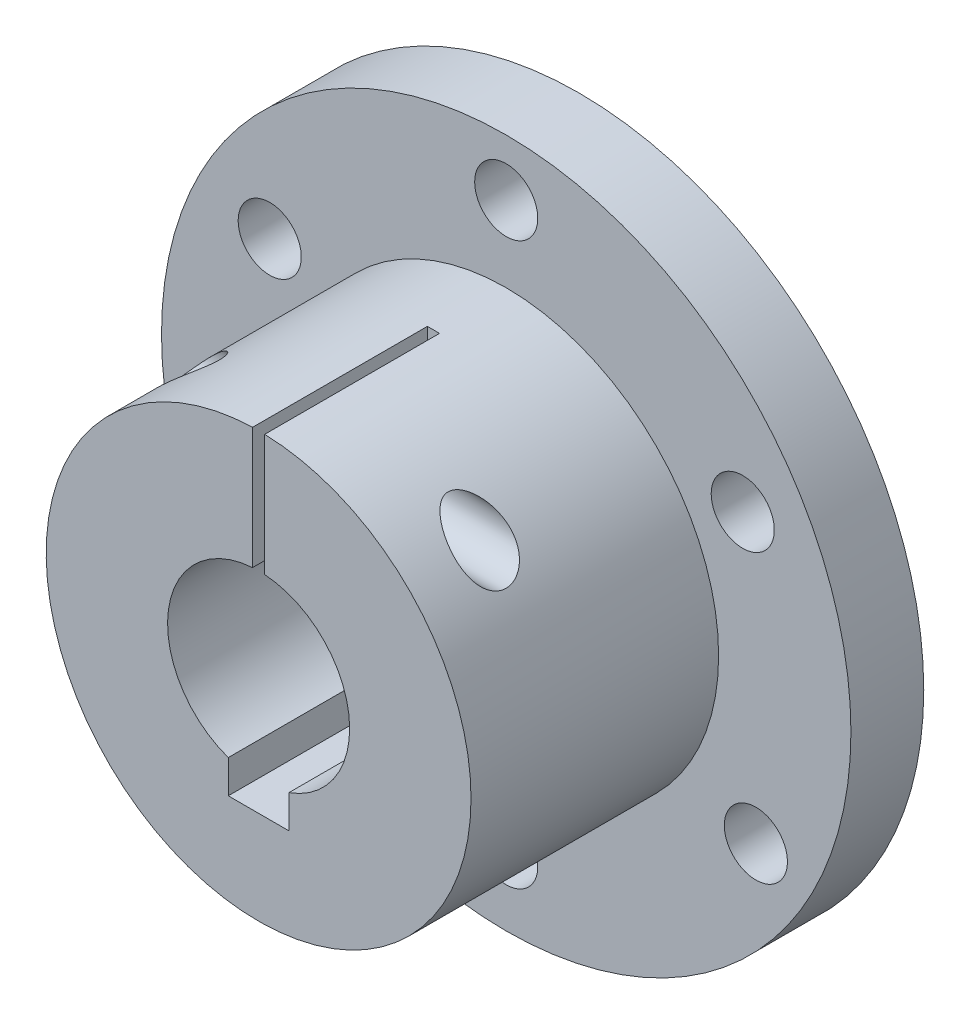
ISO-10303-21;
HEADER;
FILE_DESCRIPTION(('STEP AP214'),'2;1');
FILE_NAME('part.step','',(''),(''),'','','');
FILE_SCHEMA(('AUTOMOTIVE_DESIGN { 1 0 10303 214 1 1 1 1 }'));
ENDSEC;
DATA;
#1=APPLICATION_CONTEXT('core data for automotive mechanical design processes');
#2=APPLICATION_PROTOCOL_DEFINITION('international standard','automotive_design',2000,#1);
#3=PRODUCT_CONTEXT('',#1,'mechanical');
#4=PRODUCT('Part','Part','',(#3));
#5=PRODUCT_RELATED_PRODUCT_CATEGORY('part','',(#4));
#6=PRODUCT_DEFINITION_FORMATION('','',#4);
#7=PRODUCT_DEFINITION_CONTEXT('part definition',#1,'design');
#8=PRODUCT_DEFINITION('design','',#6,#7);
#9=PRODUCT_DEFINITION_SHAPE('','',#8);
#10=(LENGTH_UNIT() NAMED_UNIT(*) SI_UNIT(.MILLI.,.METRE.));
#11=(NAMED_UNIT(*) PLANE_ANGLE_UNIT() SI_UNIT($,.RADIAN.));
#12=(NAMED_UNIT(*) SI_UNIT($,.STERADIAN.) SOLID_ANGLE_UNIT());
#13=UNCERTAINTY_MEASURE_WITH_UNIT(LENGTH_MEASURE(1.E-05),#10,'distance_accuracy_value','');
#14=(GEOMETRIC_REPRESENTATION_CONTEXT(3) GLOBAL_UNCERTAINTY_ASSIGNED_CONTEXT((#13)) GLOBAL_UNIT_ASSIGNED_CONTEXT((#10,
#11,#12)) REPRESENTATION_CONTEXT('',''));
#15=CARTESIAN_POINT('',(0.,0.,0.));
#16=DIRECTION('',(0.,0.,1.));
#17=DIRECTION('',(1.,0.,0.));
#18=AXIS2_PLACEMENT_3D('',#15,#16,#17);
#19=CARTESIAN_POINT('',(0.,0.,31.4));
#20=DIRECTION('',(0.,0.,1.));
#21=DIRECTION('',(1.,0.,0.));
#22=AXIS2_PLACEMENT_3D('',#19,#20,#21);
#23=CYLINDRICAL_SURFACE('',#22,7.5);
#24=DIRECTION('',(0.,0.,1.));
#25=VECTOR('',#24,1.);
#26=CARTESIAN_POINT('',(-0.5,7.48331477354788,31.4));
#27=LINE('',#26,#25);
#28=CARTESIAN_POINT('',(-0.5,7.48331477354788,26.4));
#29=VERTEX_POINT('',#28);
#30=CARTESIAN_POINT('',(-0.5,7.48331477354788,12.));
#31=VERTEX_POINT('',#30);
#32=EDGE_CURVE('E118',#29,#31,#27,.F.);
#33=ORIENTED_EDGE('',*,*,#32,.F.);
#34=CARTESIAN_POINT('',(0.,0.,26.4));
#35=DIRECTION('',(0.,0.,1.));
#36=DIRECTION('',(1.,0.,0.));
#37=AXIS2_PLACEMENT_3D('',#34,#35,#36);
#38=CIRCLE('',#37,7.5);
#39=CARTESIAN_POINT('',(-2.5,-7.07106781186548,26.4));
#40=VERTEX_POINT('',#39);
#41=EDGE_CURVE('E134',#29,#40,#38,.T.);
#42=ORIENTED_EDGE('',*,*,#41,.T.);
#43=DIRECTION('',(0.,0.,1.));
#44=VECTOR('',#43,1.);
#45=CARTESIAN_POINT('',(-2.5,-7.07106781186548,31.4));
#46=LINE('',#45,#44);
#47=CARTESIAN_POINT('',(-2.5,-7.07106781186548,0.));
#48=VERTEX_POINT('',#47);
#49=EDGE_CURVE('E201',#48,#40,#46,.T.);
#50=ORIENTED_EDGE('',*,*,#49,.F.);
#51=CARTESIAN_POINT('',(0.,0.,0.));
#52=DIRECTION('',(0.,0.,1.));
#53=DIRECTION('',(1.,0.,0.));
#54=AXIS2_PLACEMENT_3D('',#51,#52,#53);
#55=CIRCLE('',#54,7.5);
#56=CARTESIAN_POINT('',(2.5,-7.07106781186548,0.));
#57=VERTEX_POINT('',#56);
#58=EDGE_CURVE('E143',#57,#48,#55,.T.);
#59=ORIENTED_EDGE('',*,*,#58,.F.);
#60=DIRECTION('',(0.,0.,1.));
#61=VECTOR('',#60,1.);
#62=CARTESIAN_POINT('',(2.5,-7.07106781186548,31.4));
#63=LINE('',#62,#61);
#64=CARTESIAN_POINT('',(2.5,-7.07106781186548,26.4));
#65=VERTEX_POINT('',#64);
#66=EDGE_CURVE('E199',#65,#57,#63,.F.);
#67=ORIENTED_EDGE('',*,*,#66,.F.);
#68=CARTESIAN_POINT('',(0.5,7.48331477354788,26.4));
#69=VERTEX_POINT('',#68);
#70=EDGE_CURVE('E128',#65,#69,#38,.T.);
#71=ORIENTED_EDGE('',*,*,#70,.T.);
#72=DIRECTION('',(0.,0.,1.));
#73=VECTOR('',#72,1.);
#74=CARTESIAN_POINT('',(0.5,7.48331477354788,31.4));
#75=LINE('',#74,#73);
#76=CARTESIAN_POINT('',(0.5,7.48331477354788,12.));
#77=VERTEX_POINT('',#76);
#78=EDGE_CURVE('E170',#77,#69,#75,.T.);
#79=ORIENTED_EDGE('',*,*,#78,.F.);
#80=CARTESIAN_POINT('',(0.,0.,12.));
#81=DIRECTION('',(0.,0.,-1.));
#82=DIRECTION('',(-1.,0.,0.));
#83=AXIS2_PLACEMENT_3D('',#80,#81,#82);
#84=CIRCLE('',#83,7.5);
#85=EDGE_CURVE('E172',#77,#31,#84,.F.);
#86=ORIENTED_EDGE('',*,*,#85,.T.);
#87=EDGE_LOOP('',(#33,#42,#50,#59,#67,#71,#79,#86));
#88=FACE_BOUND('',#87,.T.);
#89=ADVANCED_FACE('F41',(#88),#23,.F.);
#90=CARTESIAN_POINT('',(0.,17.5,26.4));
#91=DIRECTION('',(0.,0.,-1.));
#92=DIRECTION('',(-1.,0.,0.));
#93=AXIS2_PLACEMENT_3D('',#90,#91,#92);
#94=PLANE('',#93);
#95=DIRECTION('',(0.,-1.,0.));
#96=VECTOR('',#95,1.);
#97=CARTESIAN_POINT('',(-0.5,7.,26.4));
#98=LINE('',#97,#96);
#99=CARTESIAN_POINT('',(-0.5,17.4928556845359,26.4));
#100=VERTEX_POINT('',#99);
#101=EDGE_CURVE('E173',#100,#29,#98,.T.);
#102=ORIENTED_EDGE('',*,*,#101,.F.);
#103=CARTESIAN_POINT('',(0.,0.,26.4));
#104=DIRECTION('',(0.,0.,1.));
#105=DIRECTION('',(1.,0.,0.));
#106=AXIS2_PLACEMENT_3D('',#103,#104,#105);
#107=CIRCLE('',#106,17.5);
#108=CARTESIAN_POINT('',(0.5,17.4928556845359,26.4));
#109=VERTEX_POINT('',#108);
#110=EDGE_CURVE('E124',#100,#109,#107,.T.);
#111=ORIENTED_EDGE('',*,*,#110,.T.);
#112=DIRECTION('',(0.,1.,0.));
#113=VECTOR('',#112,1.);
#114=CARTESIAN_POINT('',(0.5,7.,26.4));
#115=LINE('',#114,#113);
#116=EDGE_CURVE('E169',#69,#109,#115,.T.);
#117=ORIENTED_EDGE('',*,*,#116,.F.);
#118=ORIENTED_EDGE('',*,*,#70,.F.);
#119=DIRECTION('',(0.,1.,0.));
#120=VECTOR('',#119,1.);
#121=CARTESIAN_POINT('',(2.5,-9.8,26.4));
#122=LINE('',#121,#120);
#123=CARTESIAN_POINT('',(2.5,-9.8,26.4));
#124=VERTEX_POINT('',#123);
#125=EDGE_CURVE('E185',#124,#65,#122,.T.);
#126=ORIENTED_EDGE('',*,*,#125,.F.);
#127=DIRECTION('',(1.,0.,0.));
#128=VECTOR('',#127,1.);
#129=CARTESIAN_POINT('',(-2.5,-9.8,26.4));
#130=LINE('',#129,#128);
#131=CARTESIAN_POINT('',(-2.5,-9.8,26.4));
#132=VERTEX_POINT('',#131);
#133=EDGE_CURVE('E183',#132,#124,#130,.T.);
#134=ORIENTED_EDGE('',*,*,#133,.F.);
#135=DIRECTION('',(0.,-1.,0.));
#136=VECTOR('',#135,1.);
#137=CARTESIAN_POINT('',(-2.5,17.5,26.4));
#138=LINE('',#137,#136);
#139=EDGE_CURVE('E112',#40,#132,#138,.T.);
#140=ORIENTED_EDGE('',*,*,#139,.F.);
#141=ORIENTED_EDGE('',*,*,#41,.F.);
#142=EDGE_LOOP('',(#102,#111,#117,#118,#126,#134,#140,#141));
#143=FACE_BOUND('',#142,.T.);
#144=ADVANCED_FACE('F250',(#143),#94,.F.);
#145=CARTESIAN_POINT('',(0.,0.,31.4));
#146=DIRECTION('',(0.,0.,1.));
#147=DIRECTION('',(1.,0.,0.));
#148=AXIS2_PLACEMENT_3D('',#145,#146,#147);
#149=CYLINDRICAL_SURFACE('',#148,17.5);
#150=CARTESIAN_POINT('',(-12.2474487139159,12.5,17.95));
#151=CARTESIAN_POINT('',(-12.1522040773826,12.5933212663865,17.9500000419497));
#152=CARTESIAN_POINT('',(-12.0559074954255,12.6855330676888,17.9557972213178));
#153=CARTESIAN_POINT('',(-11.8619096844028,12.8671188759277,17.97826773321));
#154=CARTESIAN_POINT('',(-11.7642083125915,12.9564925914735,17.9949421787588));
#155=CARTESIAN_POINT('',(-11.5678350690495,13.1321208597426,18.0387182983057));
#156=CARTESIAN_POINT('',(-11.4691612173972,13.2183657301261,18.0658497445487));
#157=CARTESIAN_POINT('',(-11.2718715433525,13.3869989353032,18.1302467965837));
#158=CARTESIAN_POINT('',(-11.1732557124584,13.4693884629101,18.1675092432968));
#159=CARTESIAN_POINT('',(-10.9937031301419,13.6161501744256,18.2449137680702));
#160=CARTESIAN_POINT('',(-10.912628716057,13.6811930102801,18.2834720528011));
#161=CARTESIAN_POINT('',(-10.7516667428677,13.8080467440677,18.3677034052161));
#162=CARTESIAN_POINT('',(-10.6717789469255,13.869858293313,18.4133750316614));
#163=CARTESIAN_POINT('',(-10.5141460216612,13.9897286261055,18.5120368365639));
#164=CARTESIAN_POINT('',(-10.4363954577747,14.0477975563416,18.5650058900721));
#165=CARTESIAN_POINT('',(-10.2838681691478,14.1598374960728,18.6788766566599));
#166=CARTESIAN_POINT('',(-10.2090894167264,14.213811323357,18.7397728353745));
#167=CARTESIAN_POINT('',(-10.0608653945197,14.3191335845127,18.8730577828207));
#168=CARTESIAN_POINT('',(-9.98760760656149,14.3702769502637,18.9458214554698));
#169=CARTESIAN_POINT('',(-9.84839340662193,14.4660380686046,19.1020120754287));
#170=CARTESIAN_POINT('',(-9.7824326194137,14.5106597367672,19.1854325676166));
#171=CARTESIAN_POINT('',(-9.67411259233128,14.5830347039988,19.3458608959763));
#172=CARTESIAN_POINT('',(-9.62968086179119,14.6123732924364,19.4207289887193));
#173=CARTESIAN_POINT('',(-9.55106109777215,14.6638822377733,19.5779720535835));
#174=CARTESIAN_POINT('',(-9.51685344877045,14.6860663275647,19.6603322502762));
#175=CARTESIAN_POINT('',(-9.46825371792253,14.7174326407678,19.8125388924951));
#176=CARTESIAN_POINT('',(-9.45115557349929,14.7284031215201,19.8811406772304));
#177=CARTESIAN_POINT('',(-9.42688904240768,14.7439471682073,20.0207800952692));
#178=CARTESIAN_POINT('',(-9.41971088723964,14.7485270272149,20.0918152615914));
#179=CARTESIAN_POINT('',(-9.41604345162466,14.7508688733061,20.2344517813615));
#180=CARTESIAN_POINT('',(-9.41957947040462,14.7486147233341,20.3060540760942));
#181=CARTESIAN_POINT('',(-9.43699387774481,14.7374776178851,20.4474647015401));
#182=CARTESIAN_POINT('',(-9.45088050355857,14.7285893828414,20.5172715576034));
#183=CARTESIAN_POINT('',(-9.49183497455444,14.7022371555365,20.6688729681415));
#184=CARTESIAN_POINT('',(-9.52118233481176,14.6832825255284,20.749783201873));
#185=CARTESIAN_POINT('',(-9.59024903347757,14.6382657121896,20.9048964192842));
#186=CARTESIAN_POINT('',(-9.62998857336336,14.6121896810595,20.9790859561049));
#187=CARTESIAN_POINT('',(-9.74017498186041,14.5390966178768,21.158297148306));
#188=CARTESIAN_POINT('',(-9.8156887518723,14.4883321474864,21.25863233296));
#189=CARTESIAN_POINT('',(-9.9772500767055,14.3775572876307,21.444604311942));
#190=CARTESIAN_POINT('',(-10.0633249955013,14.3175227709204,21.5302014813802));
#191=CARTESIAN_POINT('',(-10.22670666434,14.2011543868874,21.6750107290466));
#192=CARTESIAN_POINT('',(-10.3030350701454,14.1459112077346,21.7362369234504));
#193=CARTESIAN_POINT('',(-10.4586527985715,14.0312482809718,21.8505573271841));
#194=CARTESIAN_POINT('',(-10.537943973804,13.9718258989178,21.9036463388217));
#195=CARTESIAN_POINT('',(-10.6984800039877,13.8492865276998,22.0022522158045));
#196=CARTESIAN_POINT('',(-10.7797266669341,13.7861660354699,22.0477617393701));
#197=CARTESIAN_POINT('',(-10.9433290558688,13.6566627192799,22.131469356474));
#198=CARTESIAN_POINT('',(-11.0256845498607,13.5902805702739,22.1696689547573));
#199=CARTESIAN_POINT('',(-11.1953276344422,13.4509222240732,22.2407558826161));
#200=CARTESIAN_POINT('',(-11.2826450411075,13.3777830389718,22.2732537474998));
#201=CARTESIAN_POINT('',(-11.4573169961625,13.2284967943745,22.3303001176751));
#202=CARTESIAN_POINT('',(-11.5446715470018,13.1523487095455,22.3548458864839));
#203=CARTESIAN_POINT('',(-11.8058728147184,12.9199620156976,22.4162602486025));
#204=CARTESIAN_POINT('',(-11.9791136498613,12.7595710588408,22.4410129086555));
#205=CARTESIAN_POINT('',(-12.3044126651556,12.4458008231085,22.4543222120222));
#206=CARTESIAN_POINT('',(-12.4569804726638,12.2930754931909,22.4459153197622));
#207=CARTESIAN_POINT('',(-12.7537928612296,11.9848343943699,22.3957719723718));
#208=CARTESIAN_POINT('',(-12.8980467276746,11.8293220031545,22.3540735037411));
#209=CARTESIAN_POINT('',(-13.1395918056594,11.5596474314903,22.2478606693313));
#210=CARTESIAN_POINT('',(-13.239675935283,11.4447682675771,22.1915366502453));
#211=CARTESIAN_POINT('',(-13.430037161574,11.2207651185962,22.0555747066813));
#212=CARTESIAN_POINT('',(-13.5203281336911,11.1116331065914,21.9759703744868));
#213=CARTESIAN_POINT('',(-13.671529487561,10.9247805263274,21.8104564206716));
#214=CARTESIAN_POINT('',(-13.7347276408131,10.8450998930848,21.7288544131879));
#215=CARTESIAN_POINT('',(-13.850957999529,10.6962544692031,21.5499943801732));
#216=CARTESIAN_POINT('',(-13.9039923636012,10.6270874463066,21.4527396870853));
#217=CARTESIAN_POINT('',(-13.9745175183101,10.5339647483906,21.2958869707906));
#218=CARTESIAN_POINT('',(-13.996606463531,10.5045787097009,21.2414827682473));
#219=CARTESIAN_POINT('',(-14.0374109438895,10.4499880481013,21.1294230870891));
#220=CARTESIAN_POINT('',(-14.0561282950689,10.4247811747535,21.0717693808592));
#221=CARTESIAN_POINT('',(-14.0899470943955,10.3790271344619,20.9536460418807));
#222=CARTESIAN_POINT('',(-14.1050502291493,10.3584777942759,20.8931777383879));
#223=CARTESIAN_POINT('',(-14.1314433892039,10.3224416278526,20.7699702969262));
#224=CARTESIAN_POINT('',(-14.1427341313856,10.3069538498587,20.7072315883425));
#225=CARTESIAN_POINT('',(-14.167936423218,10.2723097936009,20.5348918422143));
#226=CARTESIAN_POINT('',(-14.178029208045,10.2583397033499,20.4236069818539));
#227=CARTESIAN_POINT('',(-14.1860739120446,10.2472120891515,20.1998550955314));
#228=CARTESIAN_POINT('',(-14.1840322619749,10.2500456599446,20.0873887272628));
#229=CARTESIAN_POINT('',(-14.168586152688,10.2713829761999,19.8738898712716));
#230=CARTESIAN_POINT('',(-14.1561002468825,10.2886198527099,19.7726604824182));
#231=CARTESIAN_POINT('',(-14.1214405659414,10.3361391910428,19.5750721680084));
#232=CARTESIAN_POINT('',(-14.0992668134534,10.3664216223686,19.4787132310668));
#233=CARTESIAN_POINT('',(-14.0452514781401,10.4394931833855,19.2904411384314));
#234=CARTESIAN_POINT('',(-14.0131550384387,10.4826107373709,19.198729815032));
#235=CARTESIAN_POINT('',(-13.9405740641308,10.5789426068284,19.0244289074966));
#236=CARTESIAN_POINT('',(-13.9000871402103,10.6321597979563,18.9418419319457));
#237=CARTESIAN_POINT('',(-13.8067193975451,10.7531841467737,18.7777877595605));
#238=CARTESIAN_POINT('',(-13.7529472188848,10.8219664928764,18.6975514338593));
#239=CARTESIAN_POINT('',(-13.6378095852935,10.9667104230734,18.5500837259595));
#240=CARTESIAN_POINT('',(-13.5764379664496,11.0426778230203,18.482863015528));
#241=CARTESIAN_POINT('',(-13.4163045811026,11.2372268646166,18.3319786824184));
#242=CARTESIAN_POINT('',(-13.3137788937911,11.3586994778077,18.2560066278603));
#243=CARTESIAN_POINT('',(-13.0986169364493,11.6061725400736,18.1304844008298));
#244=CARTESIAN_POINT('',(-12.9859666171655,11.7321791306884,18.0809716265573));
#245=CARTESIAN_POINT('',(-12.770338817393,11.9662032668523,18.0113425236066));
#246=CARTESIAN_POINT('',(-12.6683226431433,12.074183649329,17.9880077327836));
#247=CARTESIAN_POINT('',(-12.4604633618215,12.2885771533304,17.957340068581));
#248=CARTESIAN_POINT('',(-12.3546220088737,12.3949909625118,17.9499999527964));
#249=CARTESIAN_POINT('',(-12.2474487139159,12.5,17.95));
#250=B_SPLINE_CURVE_WITH_KNOTS('',3,(#150,#151,#152,#153,#154,#155,#156,#157,#158,#159,#160,
#161,#162,#163,#164,#165,#166,#167,#168,#169,#170,#171,#172,#173,#174,#175,#176,#177,#178,#179,
#180,#181,#182,#183,#184,#185,#186,#187,#188,#189,#190,#191,#192,#193,#194,#195,#196,#197,#198,
#199,#200,#201,#202,#203,#204,#205,#206,#207,#208,#209,#210,#211,#212,#213,#214,#215,#216,#217,
#218,#219,#220,#221,#222,#223,#224,#225,#226,#227,#228,#229,#230,#231,#232,#233,#234,#235,#236,
#237,#238,#239,#240,#241,#242,#243,#244,#245,#246,#247,#248,#249),.UNSPECIFIED.,.T.,.F.,(4,2,2,
2,2,2,2,2,2,2,2,2,2,2,2,2,2,2,2,2,2,2,2,2,2,2,2,2,2,2,2,2,2,2,2,2,2,2,2,2,2,2,2,2,2,2,2,2,2,4),
(0.,0.399870103820586,0.799781131082086,1.20083926218374,1.60177247728559,1.93410031352063,
2.26636090397687,2.5976791067902,2.92876722631051,3.27374215930303,3.61850911381318,
3.89324020888378,4.1674407813249,4.3811850853733,4.59471875889637,4.80875703907062,
5.02296583799252,5.28589176369346,5.54933264331363,5.95342498947639,6.35858737247436,
6.69524186320735,7.03211050654649,7.3693035793933,7.70642716634947,8.06144032890953,
8.41657552948472,9.12581033507833,9.77167587524354,10.416805518505,10.9024271265477,
11.3873514363707,11.7770536414048,12.1666729886631,12.3634039054601,12.5600285381379,
12.7565612344405,12.9530569542083,13.2888868599089,13.6245388052759,13.9334401872113,
14.2423408470194,14.559947276686,14.8776442740401,15.2320322196304,15.5867095159502,
16.1123417641157,16.6387150019233,17.0888696346558,17.5388203945245),.UNSPECIFIED.);
#251=CARTESIAN_POINT('',(-12.2474487139159,12.5,17.95));
#252=VERTEX_POINT('',#251);
#253=EDGE_CURVE('E119',#252,#252,#250,.T.);
#254=ORIENTED_EDGE('',*,*,#253,.T.);
#255=EDGE_LOOP('',(#254));
#256=FACE_BOUND('',#255,.T.);
#257=CARTESIAN_POINT('',(12.2474487139159,12.5,17.95));
#258=CARTESIAN_POINT('',(12.3831413163131,12.3670503919891,17.9500021625631));
#259=CARTESIAN_POINT('',(12.5166723210717,12.231864197944,17.9617483440248));
#260=CARTESIAN_POINT('',(12.7770105147035,11.9596551567851,18.0114741521981));
#261=CARTESIAN_POINT('',(12.9038202379974,11.8226330267258,18.0494438138435));
#262=CARTESIAN_POINT('',(13.1294387230914,11.5711726144584,18.1469139729837));
#263=CARTESIAN_POINT('',(13.2296078142974,11.456404850171,18.2023751682437));
#264=CARTESIAN_POINT('',(13.4202808234122,11.2324346051531,18.3364673537197));
#265=CARTESIAN_POINT('',(13.5107966889426,11.1232253344337,18.4150692389093));
#266=CARTESIAN_POINT('',(13.6630171699429,10.9354341489767,18.5791706391925));
#267=CARTESIAN_POINT('',(13.7269227485712,10.854986234708,18.6604860239109));
#268=CARTESIAN_POINT('',(13.8445490042998,10.7045579485731,18.8389513069233));
#269=CARTESIAN_POINT('',(13.8982720632481,10.6345751295704,18.9360974922369));
#270=CARTESIAN_POINT('',(13.9698018279067,10.5402197817767,19.0929538783823));
#271=CARTESIAN_POINT('',(13.9922236174007,10.5104177249854,19.1473915843809));
#272=CARTESIAN_POINT('',(14.0336765680399,10.4550042550919,19.2595754984536));
#273=CARTESIAN_POINT('',(14.0527095663786,10.4293905719303,19.3173198912656));
#274=CARTESIAN_POINT('',(14.0871372592567,10.3828419038424,19.435681880002));
#275=CARTESIAN_POINT('',(14.1025336944923,10.3619046807194,19.4962980845399));
#276=CARTESIAN_POINT('',(14.1294860900232,10.3251216616697,19.6198568212476));
#277=CARTESIAN_POINT('',(14.1410427914144,10.3092748832707,19.6827989018979));
#278=CARTESIAN_POINT('',(14.1668787811235,10.2737700943578,19.8554691844411));
#279=CARTESIAN_POINT('',(14.1773397576446,10.259292897975,19.9669170821156));
#280=CARTESIAN_POINT('',(14.1860701946476,10.2472176779549,20.1911060885718));
#281=CARTESIAN_POINT('',(14.1843462755212,10.2496104883733,20.3038464618753));
#282=CARTESIAN_POINT('',(14.1694625256681,10.270173398967,20.5177521730712));
#283=CARTESIAN_POINT('',(14.1572458708118,10.2870421725752,20.6191122016249));
#284=CARTESIAN_POINT('',(14.1231010377608,10.3338690285867,20.8170254784208));
#285=CARTESIAN_POINT('',(14.101173016225,10.3638268998434,20.9135788041743));
#286=CARTESIAN_POINT('',(14.0476618900286,10.4362474762689,21.1021662613491));
#287=CARTESIAN_POINT('',(14.0158354687432,10.4790241924621,21.1940095753556));
#288=CARTESIAN_POINT('',(13.943780505157,10.5747135897283,21.3686310598243));
#289=CARTESIAN_POINT('',(13.9035492953002,10.6276294883855,21.4514063394807));
#290=CARTESIAN_POINT('',(13.8107476767822,10.7480063030614,21.6158216845891));
#291=CARTESIAN_POINT('',(13.7572918630817,10.816438889115,21.6962465120217));
#292=CARTESIAN_POINT('',(13.6427869403079,10.9605141028566,21.8441305374405));
#293=CARTESIAN_POINT('',(13.581732866759,11.0361614368245,21.9115811844568));
#294=CARTESIAN_POINT('',(13.4225069287627,11.2298055071665,22.0629559624353));
#295=CARTESIAN_POINT('',(13.3205817345046,11.3507059500646,22.139254934233));
#296=CARTESIAN_POINT('',(13.1065744318443,11.597178870727,22.2655950745065));
#297=CARTESIAN_POINT('',(12.9944711738,11.7227607419369,22.3155800282883));
#298=CARTESIAN_POINT('',(12.725726632734,12.014853668858,22.4039301671047));
#299=CARTESIAN_POINT('',(12.5663558064714,12.181539871458,22.4333895657989));
#300=CARTESIAN_POINT('',(12.2399318969479,12.5095129804388,22.4559925493426));
#301=CARTESIAN_POINT('',(12.072871598936,12.6707945602195,22.4491013096365));
#302=CARTESIAN_POINT('',(11.7313317201043,12.9877307896336,22.4024552011976));
#303=CARTESIAN_POINT('',(11.5567700154627,13.143196378454,22.3620138393309));
#304=CARTESIAN_POINT('',(11.295052296197,13.3673144883005,22.277649698083));
#305=CARTESIAN_POINT('',(11.2077965701357,13.4405365179802,22.2455591653921));
#306=CARTESIAN_POINT('',(11.0338476574507,13.5836981995336,22.1734548689278));
#307=CARTESIAN_POINT('',(10.9471543696415,13.6536384567687,22.1334425735798));
#308=CARTESIAN_POINT('',(10.7904677306785,13.7776605936974,22.0532442431034));
#309=CARTESIAN_POINT('',(10.7202673773963,13.8323372541337,22.0143759348157));
#310=CARTESIAN_POINT('',(10.5811986696684,13.9390066861373,21.930994675643));
#311=CARTESIAN_POINT('',(10.5123300666956,13.9909999615518,21.8864827898927));
#312=CARTESIAN_POINT('',(10.3766343962252,14.091933711588,21.7915532032179));
#313=CARTESIAN_POINT('',(10.3098044674909,14.140878575664,21.7411443095686));
#314=CARTESIAN_POINT('',(10.1789636451434,14.2353505824369,21.6339316016735));
#315=CARTESIAN_POINT('',(10.1149512183167,14.2808795937017,21.5771313268375));
#316=CARTESIAN_POINT('',(9.98070262927931,14.3750944027658,21.4466076981321));
#317=CARTESIAN_POINT('',(9.91116625764539,14.4230743180192,21.3716365216905));
#318=CARTESIAN_POINT('',(9.78031024518877,14.5121248897208,21.2110698783771));
#319=CARTESIAN_POINT('',(9.71898089099628,14.5532037288794,21.1254872061067));
#320=CARTESIAN_POINT('',(9.62229199665563,14.6172506108526,20.9650403860081));
#321=CARTESIAN_POINT('',(9.58424174504823,14.6421946279259,20.8926132052939));
#322=CARTESIAN_POINT('',(9.51808218753041,14.6852877112241,20.7414438039259));
#323=CARTESIAN_POINT('',(9.4899558130957,14.7034484475056,20.6627127147301));
#324=CARTESIAN_POINT('',(9.45034693001214,14.7289308214658,20.5146058685157));
#325=CARTESIAN_POINT('',(9.43680717340741,14.7375970463438,20.4460200904454));
#326=CARTESIAN_POINT('',(9.41971918308486,14.7485253463536,20.3071171272251));
#327=CARTESIAN_POINT('',(9.41616351421448,14.7507921871149,20.2368012698532));
#328=CARTESIAN_POINT('',(9.419419321737,14.7487132193885,20.0964821713687));
#329=CARTESIAN_POINT('',(9.42623581004196,14.7443642140695,20.0264790977913));
#330=CARTESIAN_POINT('',(9.44952062944111,14.7294516049878,19.888781752767));
#331=CARTESIAN_POINT('',(9.46599740690006,14.7188825627755,19.8210895566872));
#332=CARTESIAN_POINT('',(9.51353108343117,14.6882177534313,19.6690212798767));
#333=CARTESIAN_POINT('',(9.54752171135998,14.6661862195688,19.5859628894259));
#334=CARTESIAN_POINT('',(9.62593409835106,14.6148416370089,19.4273862388385));
#335=CARTESIAN_POINT('',(9.67037861446558,14.5855126944238,19.3518849482916));
#336=CARTESIAN_POINT('',(9.7940303255252,14.5029353325626,19.1675251567362));
#337=CARTESIAN_POINT('',(9.87861831325814,14.445578142245,19.0641632219744));
#338=CARTESIAN_POINT('',(10.0582302239783,14.3211052069187,18.8737042303655));
#339=CARTESIAN_POINT('',(10.1532814611233,14.2539637650683,18.7866514272635));
#340=CARTESIAN_POINT('',(10.3317130118593,14.1249979202544,18.6413116611349));
#341=CARTESIAN_POINT('',(10.4140972506519,14.0644061923304,18.5806693624055));
#342=CARTESIAN_POINT('',(10.5815507320813,13.9388572924275,18.4681504791283));
#343=CARTESIAN_POINT('',(10.6666216018552,13.8738974469592,18.4162793324518));
#344=CARTESIAN_POINT('',(10.8384219944502,13.7401044347928,18.3207991340757));
#345=CARTESIAN_POINT('',(10.9251525183179,13.6712688784595,18.2771952536778));
#346=CARTESIAN_POINT('',(11.0994202143326,13.5301685088133,18.1980533614932));
#347=CARTESIAN_POINT('',(11.1869571736276,13.4579045806128,18.1625132814069));
#348=CARTESIAN_POINT('',(11.4382513344401,13.2462091276799,18.0720493785722));
#349=CARTESIAN_POINT('',(11.6023504653303,13.1028174865586,18.0270016422864));
#350=CARTESIAN_POINT('',(11.9277621265328,12.8072925378786,17.9659925916525));
#351=CARTESIAN_POINT('',(12.089077678587,12.6551696016974,17.9499974760057));
#352=CARTESIAN_POINT('',(12.2474487139159,12.5,17.95));
#353=B_SPLINE_CURVE_WITH_KNOTS('',3,(#257,#258,#259,#260,#261,#262,#263,#264,#265,#266,#267,
#268,#269,#270,#271,#272,#273,#274,#275,#276,#277,#278,#279,#280,#281,#282,#283,#284,#285,#286,
#287,#288,#289,#290,#291,#292,#293,#294,#295,#296,#297,#298,#299,#300,#301,#302,#303,#304,#305,
#306,#307,#308,#309,#310,#311,#312,#313,#314,#315,#316,#317,#318,#319,#320,#321,#322,#323,#324,
#325,#326,#327,#328,#329,#330,#331,#332,#333,#334,#335,#336,#337,#338,#339,#340,#341,#342,#343,
#344,#345,#346,#347,#348,#349,#350,#351,#352),.UNSPECIFIED.,.T.,.F.,(4,2,2,2,2,2,2,2,2,2,2,2,2,
2,2,2,2,2,2,2,2,2,2,2,2,2,2,2,2,2,2,2,2,2,2,2,2,2,2,2,2,2,2,2,2,2,2,4),(0.,0.569478840526028,
1.13874139495644,1.62338767397551,2.10742697816683,2.49902516230642,2.89053163225036,
3.08824197903039,3.28584481090837,3.48335286463646,3.68082277574095,4.01741823866557,
4.35383083400595,4.66283446308485,4.97183310765839,5.28912421250456,5.60651617427819,
5.96025032740989,6.31421682532337,6.83802712580422,7.36295194834347,8.05668176276067,
8.75107630326521,9.46004025268068,9.81482584152577,10.1695457266568,10.4606584640934,
10.7517163402272,11.0423449370132,11.3328133747132,11.6708951296483,12.0085731424547,
12.26432681377,12.5196384335624,12.7300466110878,12.9402980559829,13.150651128381,
13.3611883954704,13.6368627292644,13.913142824764,14.3467966828068,14.7816107087358,
15.1378279441713,15.4942652210945,15.8509247246952,16.2074926443402,16.8729237154374,
17.5375800930047),.UNSPECIFIED.);
#354=CARTESIAN_POINT('',(12.2474487139159,12.5,17.95));
#355=VERTEX_POINT('',#354);
#356=EDGE_CURVE('E305',#355,#355,#353,.T.);
#357=ORIENTED_EDGE('',*,*,#356,.T.);
#358=EDGE_LOOP('',(#357));
#359=FACE_BOUND('',#358,.T.);
#360=CARTESIAN_POINT('',(0.,0.,6.));
#361=DIRECTION('',(0.,0.,1.));
#362=DIRECTION('',(1.,0.,0.));
#363=AXIS2_PLACEMENT_3D('',#360,#361,#362);
#364=CIRCLE('',#363,17.5);
#365=CARTESIAN_POINT('',(17.5,0.,6.));
#366=VERTEX_POINT('',#365);
#367=EDGE_CURVE('E127',#366,#366,#364,.T.);
#368=ORIENTED_EDGE('',*,*,#367,.T.);
#369=EDGE_LOOP('',(#368));
#370=FACE_BOUND('',#369,.T.);
#371=DIRECTION('',(0.,0.,1.));
#372=VECTOR('',#371,1.);
#373=CARTESIAN_POINT('',(-0.5,17.4928556845359,31.4));
#374=LINE('',#373,#372);
#375=CARTESIAN_POINT('',(-0.5,17.4928556845359,12.));
#376=VERTEX_POINT('',#375);
#377=EDGE_CURVE('E11',#376,#100,#374,.T.);
#378=ORIENTED_EDGE('',*,*,#377,.F.);
#379=CARTESIAN_POINT('',(0.,0.,12.));
#380=DIRECTION('',(0.,0.,-1.));
#381=DIRECTION('',(-1.,0.,0.));
#382=AXIS2_PLACEMENT_3D('',#379,#380,#381);
#383=CIRCLE('',#382,17.5);
#384=CARTESIAN_POINT('',(0.5,17.4928556845359,12.));
#385=VERTEX_POINT('',#384);
#386=EDGE_CURVE('E104',#376,#385,#383,.T.);
#387=ORIENTED_EDGE('',*,*,#386,.T.);
#388=DIRECTION('',(0.,0.,1.));
#389=VECTOR('',#388,1.);
#390=CARTESIAN_POINT('',(0.5,17.4928556845359,31.4));
#391=LINE('',#390,#389);
#392=EDGE_CURVE('E49',#109,#385,#391,.F.);
#393=ORIENTED_EDGE('',*,*,#392,.F.);
#394=ORIENTED_EDGE('',*,*,#110,.F.);
#395=EDGE_LOOP('',(#378,#387,#393,#394));
#396=FACE_BOUND('',#395,.T.);
#397=ADVANCED_FACE('F122',(#256,#359,#370,#396),#149,.T.);
#398=CARTESIAN_POINT('',(0.,7.5,0.));
#399=DIRECTION('',(0.,0.,1.));
#400=DIRECTION('',(1.,0.,0.));
#401=AXIS2_PLACEMENT_3D('',#398,#399,#400);
#402=PLANE('',#401);
#403=CARTESIAN_POINT('',(0.,0.,0.));
#404=DIRECTION('',(0.,0.,1.));
#405=DIRECTION('',(1.,0.,0.));
#406=AXIS2_PLACEMENT_3D('',#403,#404,#405);
#407=CIRCLE('',#406,28.4);
#408=CARTESIAN_POINT('',(28.4,0.,0.));
#409=VERTEX_POINT('',#408);
#410=EDGE_CURVE('E140',#409,#409,#407,.T.);
#411=ORIENTED_EDGE('',*,*,#410,.F.);
#412=EDGE_LOOP('',(#411));
#413=FACE_BOUND('',#412,.T.);
#414=CARTESIAN_POINT('',(0.,-22.5,0.));
#415=DIRECTION('',(0.,0.,1.));
#416=DIRECTION('',(1.,0.,0.));
#417=AXIS2_PLACEMENT_3D('',#414,#415,#416);
#418=CIRCLE('',#417,2.6);
#419=CARTESIAN_POINT('',(2.6,-22.5,0.));
#420=VERTEX_POINT('',#419);
#421=EDGE_CURVE('E204',#420,#420,#418,.T.);
#422=ORIENTED_EDGE('',*,*,#421,.T.);
#423=EDGE_LOOP('',(#422));
#424=FACE_BOUND('',#423,.T.);
#425=CARTESIAN_POINT('',(-19.4855715851499,11.25,0.));
#426=DIRECTION('',(0.,0.,1.));
#427=DIRECTION('',(1.,0.,0.));
#428=AXIS2_PLACEMENT_3D('',#425,#426,#427);
#429=CIRCLE('',#428,2.6);
#430=CARTESIAN_POINT('',(-16.8855715851499,11.25,0.));
#431=VERTEX_POINT('',#430);
#432=EDGE_CURVE('E216',#431,#431,#429,.T.);
#433=ORIENTED_EDGE('',*,*,#432,.T.);
#434=EDGE_LOOP('',(#433));
#435=FACE_BOUND('',#434,.T.);
#436=CARTESIAN_POINT('',(19.4855715851499,11.25,0.));
#437=DIRECTION('',(0.,0.,1.));
#438=DIRECTION('',(1.,0.,0.));
#439=AXIS2_PLACEMENT_3D('',#436,#437,#438);
#440=CIRCLE('',#439,2.6);
#441=CARTESIAN_POINT('',(22.0855715851499,11.25,0.));
#442=VERTEX_POINT('',#441);
#443=EDGE_CURVE('E213',#442,#442,#440,.T.);
#444=ORIENTED_EDGE('',*,*,#443,.T.);
#445=EDGE_LOOP('',(#444));
#446=FACE_BOUND('',#445,.T.);
#447=CARTESIAN_POINT('',(20.5681033398804,-11.875,0.));
#448=DIRECTION('',(0.,0.,1.));
#449=DIRECTION('',(1.,0.,0.));
#450=AXIS2_PLACEMENT_3D('',#447,#448,#449);
#451=CIRCLE('',#450,2.6);
#452=CARTESIAN_POINT('',(23.1681033398804,-11.875,0.));
#453=VERTEX_POINT('',#452);
#454=EDGE_CURVE('E210',#453,#453,#451,.T.);
#455=ORIENTED_EDGE('',*,*,#454,.T.);
#456=EDGE_LOOP('',(#455));
#457=FACE_BOUND('',#456,.T.);
#458=CARTESIAN_POINT('',(-20.5681033398804,-11.875,0.));
#459=DIRECTION('',(0.,0.,1.));
#460=DIRECTION('',(1.,0.,0.));
#461=AXIS2_PLACEMENT_3D('',#458,#459,#460);
#462=CIRCLE('',#461,2.6);
#463=CARTESIAN_POINT('',(-17.9681033398804,-11.875,0.));
#464=VERTEX_POINT('',#463);
#465=EDGE_CURVE('E207',#464,#464,#462,.T.);
#466=ORIENTED_EDGE('',*,*,#465,.T.);
#467=EDGE_LOOP('',(#466));
#468=FACE_BOUND('',#467,.T.);
#469=CARTESIAN_POINT('',(0.,23.75,0.));
#470=DIRECTION('',(0.,0.,1.));
#471=DIRECTION('',(1.,0.,0.));
#472=AXIS2_PLACEMENT_3D('',#469,#470,#471);
#473=CIRCLE('',#472,2.6);
#474=CARTESIAN_POINT('',(2.6,23.75,0.));
#475=VERTEX_POINT('',#474);
#476=EDGE_CURVE('E150',#475,#475,#473,.T.);
#477=ORIENTED_EDGE('',*,*,#476,.T.);
#478=EDGE_LOOP('',(#477));
#479=FACE_BOUND('',#478,.T.);
#480=DIRECTION('',(0.,-1.,0.));
#481=VECTOR('',#480,1.);
#482=CARTESIAN_POINT('',(-2.5,-9.8,0.));
#483=LINE('',#482,#481);
#484=CARTESIAN_POINT('',(-2.5,-9.8,0.));
#485=VERTEX_POINT('',#484);
#486=EDGE_CURVE('E182',#48,#485,#483,.T.);
#487=ORIENTED_EDGE('',*,*,#486,.T.);
#488=DIRECTION('',(1.,0.,0.));
#489=VECTOR('',#488,1.);
#490=CARTESIAN_POINT('',(-2.5,-9.8,0.));
#491=LINE('',#490,#489);
#492=CARTESIAN_POINT('',(2.5,-9.8,0.));
#493=VERTEX_POINT('',#492);
#494=EDGE_CURVE('E190',#485,#493,#491,.T.);
#495=ORIENTED_EDGE('',*,*,#494,.T.);
#496=DIRECTION('',(0.,1.,0.));
#497=VECTOR('',#496,1.);
#498=CARTESIAN_POINT('',(2.5,-9.8,0.));
#499=LINE('',#498,#497);
#500=EDGE_CURVE('E186',#493,#57,#499,.T.);
#501=ORIENTED_EDGE('',*,*,#500,.T.);
#502=ORIENTED_EDGE('',*,*,#58,.T.);
#503=EDGE_LOOP('',(#487,#495,#501,#502));
#504=FACE_BOUND('',#503,.T.);
#505=ADVANCED_FACE('F221',(#413,#424,#435,#446,#457,#468,#479,#504),#402,.F.);
#506=CARTESIAN_POINT('',(0.,0.,31.4));
#507=DIRECTION('',(0.,0.,1.));
#508=DIRECTION('',(1.,0.,0.));
#509=AXIS2_PLACEMENT_3D('',#506,#507,#508);
#510=CYLINDRICAL_SURFACE('',#509,28.4);
#511=CARTESIAN_POINT('',(0.,0.,6.));
#512=DIRECTION('',(0.,0.,1.));
#513=DIRECTION('',(1.,0.,0.));
#514=AXIS2_PLACEMENT_3D('',#511,#512,#513);
#515=CIRCLE('',#514,28.4);
#516=CARTESIAN_POINT('',(28.4,0.,6.));
#517=VERTEX_POINT('',#516);
#518=EDGE_CURVE('E131',#517,#517,#515,.T.);
#519=ORIENTED_EDGE('',*,*,#518,.F.);
#520=EDGE_LOOP('',(#519));
#521=FACE_BOUND('',#520,.T.);
#522=ORIENTED_EDGE('',*,*,#410,.T.);
#523=EDGE_LOOP('',(#522));
#524=FACE_BOUND('',#523,.T.);
#525=ADVANCED_FACE('F234',(#521,#524),#510,.T.);
#526=CARTESIAN_POINT('',(0.,28.4,6.));
#527=DIRECTION('',(0.,0.,-1.));
#528=DIRECTION('',(-1.,0.,0.));
#529=AXIS2_PLACEMENT_3D('',#526,#527,#528);
#530=PLANE('',#529);
#531=CARTESIAN_POINT('',(0.,23.75,6.));
#532=DIRECTION('',(0.,0.,-1.));
#533=DIRECTION('',(-1.,0.,0.));
#534=AXIS2_PLACEMENT_3D('',#531,#532,#533);
#535=CIRCLE('',#534,2.6);
#536=CARTESIAN_POINT('',(-2.6,23.75,6.));
#537=VERTEX_POINT('',#536);
#538=EDGE_CURVE('E162',#537,#537,#535,.F.);
#539=ORIENTED_EDGE('',*,*,#538,.F.);
#540=EDGE_LOOP('',(#539));
#541=FACE_BOUND('',#540,.T.);
#542=CARTESIAN_POINT('',(-20.5681033398804,-11.875,6.));
#543=DIRECTION('',(0.,0.,-1.));
#544=DIRECTION('',(-1.,0.,0.));
#545=AXIS2_PLACEMENT_3D('',#542,#543,#544);
#546=CIRCLE('',#545,2.6);
#547=CARTESIAN_POINT('',(-23.1681033398804,-11.875,6.));
#548=VERTEX_POINT('',#547);
#549=EDGE_CURVE('E159',#548,#548,#546,.F.);
#550=ORIENTED_EDGE('',*,*,#549,.F.);
#551=EDGE_LOOP('',(#550));
#552=FACE_BOUND('',#551,.T.);
#553=CARTESIAN_POINT('',(20.5681033398804,-11.875,6.));
#554=DIRECTION('',(0.,0.,-1.));
#555=DIRECTION('',(-1.,0.,0.));
#556=AXIS2_PLACEMENT_3D('',#553,#554,#555);
#557=CIRCLE('',#556,2.6);
#558=CARTESIAN_POINT('',(17.9681033398804,-11.875,6.));
#559=VERTEX_POINT('',#558);
#560=EDGE_CURVE('E156',#559,#559,#557,.F.);
#561=ORIENTED_EDGE('',*,*,#560,.F.);
#562=EDGE_LOOP('',(#561));
#563=FACE_BOUND('',#562,.T.);
#564=CARTESIAN_POINT('',(19.4855715851499,11.25,6.));
#565=DIRECTION('',(0.,0.,-1.));
#566=DIRECTION('',(-1.,0.,0.));
#567=AXIS2_PLACEMENT_3D('',#564,#565,#566);
#568=CIRCLE('',#567,2.6);
#569=CARTESIAN_POINT('',(16.8855715851499,11.25,6.));
#570=VERTEX_POINT('',#569);
#571=EDGE_CURVE('E153',#570,#570,#568,.F.);
#572=ORIENTED_EDGE('',*,*,#571,.F.);
#573=EDGE_LOOP('',(#572));
#574=FACE_BOUND('',#573,.T.);
#575=CARTESIAN_POINT('',(-19.4855715851499,11.25,6.));
#576=DIRECTION('',(0.,0.,-1.));
#577=DIRECTION('',(-1.,0.,0.));
#578=AXIS2_PLACEMENT_3D('',#575,#576,#577);
#579=CIRCLE('',#578,2.6);
#580=CARTESIAN_POINT('',(-22.0855715851499,11.25,6.));
#581=VERTEX_POINT('',#580);
#582=EDGE_CURVE('E149',#581,#581,#579,.F.);
#583=ORIENTED_EDGE('',*,*,#582,.F.);
#584=EDGE_LOOP('',(#583));
#585=FACE_BOUND('',#584,.T.);
#586=CARTESIAN_POINT('',(0.,-22.5,6.));
#587=DIRECTION('',(0.,0.,-1.));
#588=DIRECTION('',(-1.,0.,0.));
#589=AXIS2_PLACEMENT_3D('',#586,#587,#588);
#590=CIRCLE('',#589,2.6);
#591=CARTESIAN_POINT('',(-2.6,-22.5,6.));
#592=VERTEX_POINT('',#591);
#593=EDGE_CURVE('E146',#592,#592,#590,.F.);
#594=ORIENTED_EDGE('',*,*,#593,.F.);
#595=EDGE_LOOP('',(#594));
#596=FACE_BOUND('',#595,.T.);
#597=ORIENTED_EDGE('',*,*,#367,.F.);
#598=EDGE_LOOP('',(#597));
#599=FACE_BOUND('',#598,.T.);
#600=ORIENTED_EDGE('',*,*,#518,.T.);
#601=EDGE_LOOP('',(#600));
#602=FACE_BOUND('',#601,.T.);
#603=ADVANCED_FACE('F228',(#541,#552,#563,#574,#585,#596,#599,#602),#530,.F.);
#604=CARTESIAN_POINT('',(0.,-22.5,26.4));
#605=DIRECTION('',(0.,0.,-1.));
#606=DIRECTION('',(-1.,0.,0.));
#607=AXIS2_PLACEMENT_3D('',#604,#605,#606);
#608=CYLINDRICAL_SURFACE('',#607,2.6);
#609=ORIENTED_EDGE('',*,*,#421,.F.);
#610=EDGE_LOOP('',(#609));
#611=FACE_BOUND('',#610,.T.);
#612=ORIENTED_EDGE('',*,*,#593,.T.);
#613=EDGE_LOOP('',(#612));
#614=FACE_BOUND('',#613,.T.);
#615=ADVANCED_FACE('F224',(#611,#614),#608,.F.);
#616=CARTESIAN_POINT('',(-19.4855715851499,11.25,26.4));
#617=DIRECTION('',(0.,0.,-1.));
#618=DIRECTION('',(-1.,0.,0.));
#619=AXIS2_PLACEMENT_3D('',#616,#617,#618);
#620=CYLINDRICAL_SURFACE('',#619,2.6);
#621=ORIENTED_EDGE('',*,*,#432,.F.);
#622=EDGE_LOOP('',(#621));
#623=FACE_BOUND('',#622,.T.);
#624=ORIENTED_EDGE('',*,*,#582,.T.);
#625=EDGE_LOOP('',(#624));
#626=FACE_BOUND('',#625,.T.);
#627=ADVANCED_FACE('F227',(#623,#626),#620,.F.);
#628=CARTESIAN_POINT('',(19.4855715851499,11.25,26.4));
#629=DIRECTION('',(0.,0.,-1.));
#630=DIRECTION('',(-1.,0.,0.));
#631=AXIS2_PLACEMENT_3D('',#628,#629,#630);
#632=CYLINDRICAL_SURFACE('',#631,2.6);
#633=ORIENTED_EDGE('',*,*,#443,.F.);
#634=EDGE_LOOP('',(#633));
#635=FACE_BOUND('',#634,.T.);
#636=ORIENTED_EDGE('',*,*,#571,.T.);
#637=EDGE_LOOP('',(#636));
#638=FACE_BOUND('',#637,.T.);
#639=ADVANCED_FACE('F295',(#635,#638),#632,.F.);
#640=CARTESIAN_POINT('',(20.5681033398804,-11.875,26.4));
#641=DIRECTION('',(0.,0.,-1.));
#642=DIRECTION('',(-1.,0.,0.));
#643=AXIS2_PLACEMENT_3D('',#640,#641,#642);
#644=CYLINDRICAL_SURFACE('',#643,2.6);
#645=ORIENTED_EDGE('',*,*,#454,.F.);
#646=EDGE_LOOP('',(#645));
#647=FACE_BOUND('',#646,.T.);
#648=ORIENTED_EDGE('',*,*,#560,.T.);
#649=EDGE_LOOP('',(#648));
#650=FACE_BOUND('',#649,.T.);
#651=ADVANCED_FACE('F291',(#647,#650),#644,.F.);
#652=CARTESIAN_POINT('',(-20.5681033398804,-11.875,26.4));
#653=DIRECTION('',(0.,0.,-1.));
#654=DIRECTION('',(-1.,0.,0.));
#655=AXIS2_PLACEMENT_3D('',#652,#653,#654);
#656=CYLINDRICAL_SURFACE('',#655,2.6);
#657=ORIENTED_EDGE('',*,*,#465,.F.);
#658=EDGE_LOOP('',(#657));
#659=FACE_BOUND('',#658,.T.);
#660=ORIENTED_EDGE('',*,*,#549,.T.);
#661=EDGE_LOOP('',(#660));
#662=FACE_BOUND('',#661,.T.);
#663=ADVANCED_FACE('F287',(#659,#662),#656,.F.);
#664=CARTESIAN_POINT('',(0.,23.75,26.4));
#665=DIRECTION('',(0.,0.,-1.));
#666=DIRECTION('',(-1.,0.,0.));
#667=AXIS2_PLACEMENT_3D('',#664,#665,#666);
#668=CYLINDRICAL_SURFACE('',#667,2.6);
#669=ORIENTED_EDGE('',*,*,#476,.F.);
#670=EDGE_LOOP('',(#669));
#671=FACE_BOUND('',#670,.T.);
#672=ORIENTED_EDGE('',*,*,#538,.T.);
#673=EDGE_LOOP('',(#672));
#674=FACE_BOUND('',#673,.T.);
#675=ADVANCED_FACE('F280',(#671,#674),#668,.F.);
#676=CARTESIAN_POINT('',(-2.5,-9.8,26.4));
#677=DIRECTION('',(1.,0.,0.));
#678=DIRECTION('',(0.,0.,-1.));
#679=AXIS2_PLACEMENT_3D('',#676,#677,#678);
#680=PLANE('',#679);
#681=ORIENTED_EDGE('',*,*,#49,.T.);
#682=ORIENTED_EDGE('',*,*,#139,.T.);
#683=DIRECTION('',(0.,0.,-1.));
#684=VECTOR('',#683,1.);
#685=CARTESIAN_POINT('',(-2.5,-9.8,26.4));
#686=LINE('',#685,#684);
#687=EDGE_CURVE('E196',#132,#485,#686,.T.);
#688=ORIENTED_EDGE('',*,*,#687,.T.);
#689=ORIENTED_EDGE('',*,*,#486,.F.);
#690=EDGE_LOOP('',(#681,#682,#688,#689));
#691=FACE_BOUND('',#690,.T.);
#692=ADVANCED_FACE('F266',(#691),#680,.T.);
#693=CARTESIAN_POINT('',(2.5,-9.8,26.4));
#694=DIRECTION('',(-1.,0.,0.));
#695=DIRECTION('',(0.,0.,1.));
#696=AXIS2_PLACEMENT_3D('',#693,#694,#695);
#697=PLANE('',#696);
#698=ORIENTED_EDGE('',*,*,#66,.T.);
#699=ORIENTED_EDGE('',*,*,#500,.F.);
#700=DIRECTION('',(0.,0.,-1.));
#701=VECTOR('',#700,1.);
#702=CARTESIAN_POINT('',(2.5,-9.8,26.4));
#703=LINE('',#702,#701);
#704=EDGE_CURVE('E64',#124,#493,#703,.T.);
#705=ORIENTED_EDGE('',*,*,#704,.F.);
#706=ORIENTED_EDGE('',*,*,#125,.T.);
#707=EDGE_LOOP('',(#698,#699,#705,#706));
#708=FACE_BOUND('',#707,.T.);
#709=ADVANCED_FACE('F272',(#708),#697,.T.);
#710=CARTESIAN_POINT('',(-2.5,-9.8,26.4));
#711=DIRECTION('',(0.,1.,0.));
#712=DIRECTION('',(0.,0.,1.));
#713=AXIS2_PLACEMENT_3D('',#710,#711,#712);
#714=PLANE('',#713);
#715=ORIENTED_EDGE('',*,*,#494,.F.);
#716=ORIENTED_EDGE('',*,*,#687,.F.);
#717=ORIENTED_EDGE('',*,*,#133,.T.);
#718=ORIENTED_EDGE('',*,*,#704,.T.);
#719=EDGE_LOOP('',(#715,#716,#717,#718));
#720=FACE_BOUND('',#719,.T.);
#721=ADVANCED_FACE('F268',(#720),#714,.T.);
#722=CARTESIAN_POINT('',(-0.5,7.,26.4));
#723=DIRECTION('',(1.,0.,0.));
#724=DIRECTION('',(0.,0.,-1.));
#725=AXIS2_PLACEMENT_3D('',#722,#723,#724);
#726=PLANE('',#725);
#727=CARTESIAN_POINT('',(-0.5,12.5,20.2));
#728=DIRECTION('',(1.,0.,0.));
#729=DIRECTION('',(0.,0.,-1.));
#730=AXIS2_PLACEMENT_3D('',#727,#728,#729);
#731=CIRCLE('',#730,2.25);
#732=CARTESIAN_POINT('',(-0.5,12.5,17.95));
#733=VERTEX_POINT('',#732);
#734=EDGE_CURVE('E332',#733,#733,#731,.T.);
#735=ORIENTED_EDGE('',*,*,#734,.F.);
#736=EDGE_LOOP('',(#735));
#737=FACE_BOUND('',#736,.T.);
#738=ORIENTED_EDGE('',*,*,#32,.T.);
#739=DIRECTION('',(0.,-1.,0.));
#740=VECTOR('',#739,1.);
#741=CARTESIAN_POINT('',(-0.5,7.,12.));
#742=LINE('',#741,#740);
#743=EDGE_CURVE('E107',#376,#31,#742,.T.);
#744=ORIENTED_EDGE('',*,*,#743,.F.);
#745=ORIENTED_EDGE('',*,*,#377,.T.);
#746=ORIENTED_EDGE('',*,*,#101,.T.);
#747=EDGE_LOOP('',(#738,#744,#745,#746));
#748=FACE_BOUND('',#747,.T.);
#749=ADVANCED_FACE('F115',(#737,#748),#726,.T.);
#750=CARTESIAN_POINT('',(0.5,7.,26.4));
#751=DIRECTION('',(-1.,0.,0.));
#752=DIRECTION('',(0.,0.,1.));
#753=AXIS2_PLACEMENT_3D('',#750,#751,#752);
#754=PLANE('',#753);
#755=CARTESIAN_POINT('',(0.5,12.5,20.2));
#756=DIRECTION('',(-1.,0.,0.));
#757=DIRECTION('',(0.,0.,1.));
#758=AXIS2_PLACEMENT_3D('',#755,#756,#757);
#759=CIRCLE('',#758,2.25);
#760=CARTESIAN_POINT('',(0.5,12.5,22.45));
#761=VERTEX_POINT('',#760);
#762=EDGE_CURVE('E44',#761,#761,#759,.T.);
#763=ORIENTED_EDGE('',*,*,#762,.F.);
#764=EDGE_LOOP('',(#763));
#765=FACE_BOUND('',#764,.T.);
#766=ORIENTED_EDGE('',*,*,#78,.T.);
#767=ORIENTED_EDGE('',*,*,#116,.T.);
#768=ORIENTED_EDGE('',*,*,#392,.T.);
#769=DIRECTION('',(0.,1.,0.));
#770=VECTOR('',#769,1.);
#771=CARTESIAN_POINT('',(0.5,7.,12.));
#772=LINE('',#771,#770);
#773=EDGE_CURVE('E56',#77,#385,#772,.T.);
#774=ORIENTED_EDGE('',*,*,#773,.F.);
#775=EDGE_LOOP('',(#766,#767,#768,#774));
#776=FACE_BOUND('',#775,.T.);
#777=ADVANCED_FACE('F167',(#765,#776),#754,.T.);
#778=CARTESIAN_POINT('',(0.,0.,12.));
#779=DIRECTION('',(0.,0.,-1.));
#780=DIRECTION('',(-1.,0.,0.));
#781=AXIS2_PLACEMENT_3D('',#778,#779,#780);
#782=PLANE('',#781);
#783=ORIENTED_EDGE('',*,*,#773,.T.);
#784=ORIENTED_EDGE('',*,*,#386,.F.);
#785=ORIENTED_EDGE('',*,*,#743,.T.);
#786=ORIENTED_EDGE('',*,*,#85,.F.);
#787=EDGE_LOOP('',(#783,#784,#785,#786));
#788=FACE_BOUND('',#787,.T.);
#789=ADVANCED_FACE('F106',(#788),#782,.F.);
#790=CARTESIAN_POINT('',(-28.4,12.5,20.2));
#791=DIRECTION('',(1.,0.,0.));
#792=DIRECTION('',(0.,0.,-1.));
#793=AXIS2_PLACEMENT_3D('',#790,#791,#792);
#794=CYLINDRICAL_SURFACE('',#793,2.25);
#795=ORIENTED_EDGE('',*,*,#762,.T.);
#796=EDGE_LOOP('',(#795));
#797=FACE_BOUND('',#796,.T.);
#798=ORIENTED_EDGE('',*,*,#356,.F.);
#799=EDGE_LOOP('',(#798));
#800=FACE_BOUND('',#799,.T.);
#801=ADVANCED_FACE('F319',(#797,#800),#794,.F.);
#802=ORIENTED_EDGE('',*,*,#734,.T.);
#803=EDGE_LOOP('',(#802));
#804=FACE_BOUND('',#803,.T.);
#805=ORIENTED_EDGE('',*,*,#253,.F.);
#806=EDGE_LOOP('',(#805));
#807=FACE_BOUND('',#806,.T.);
#808=ADVANCED_FACE('F315',(#804,#807),#794,.F.);
#809=CLOSED_SHELL('',(#89,#144,#397,#505,#525,#603,#615,#627,#639,#651,#663,#675,#692,#709,#721,
#749,#777,#789,#801,#808));
#810=MANIFOLD_SOLID_BREP('B2',#809);
#811=ADVANCED_BREP_SHAPE_REPRESENTATION('',(#18,#810),#14);
#812=SHAPE_DEFINITION_REPRESENTATION(#9,#811);
ENDSEC;
END-ISO-10303-21;
